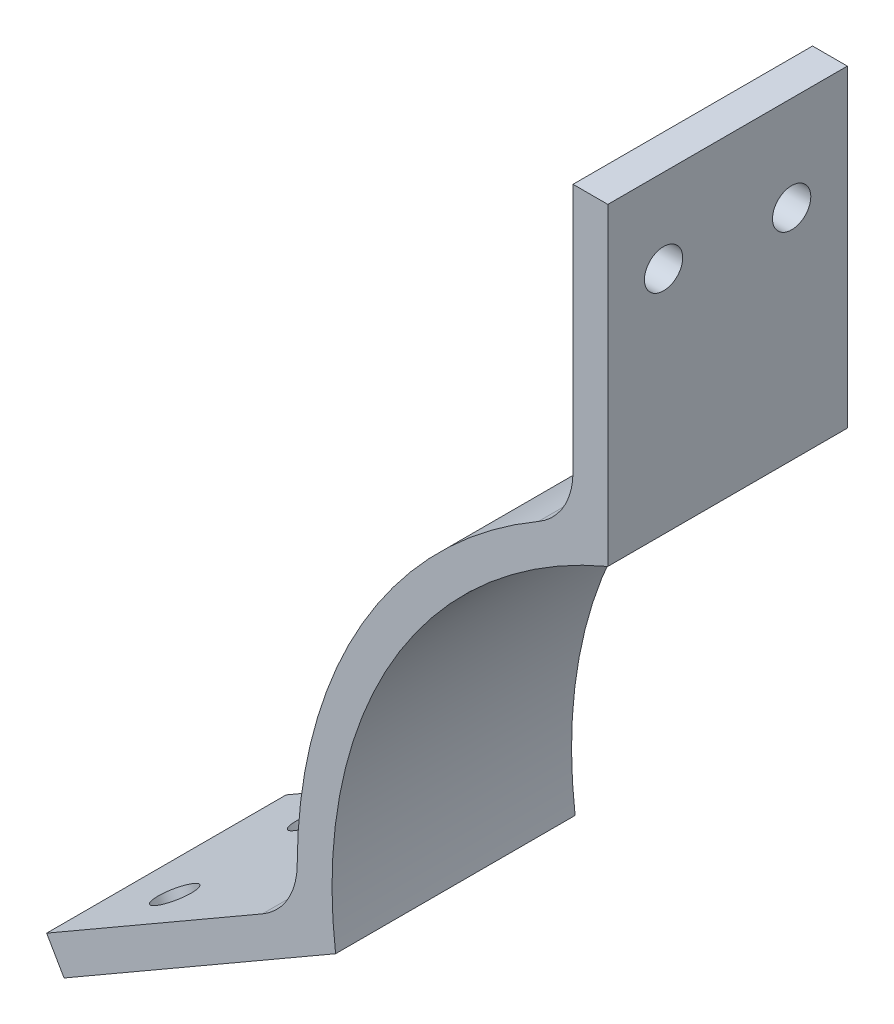
ISO-10303-21;
HEADER;
FILE_DESCRIPTION(('STEP AP214'),'2;1');
FILE_NAME('part.step','',(''),(''),'','','');
FILE_SCHEMA(('AUTOMOTIVE_DESIGN { 1 0 10303 214 1 1 1 1 }'));
ENDSEC;
DATA;
#1=APPLICATION_CONTEXT('core data for automotive mechanical design processes');
#2=APPLICATION_PROTOCOL_DEFINITION('international standard','automotive_design',2000,#1);
#3=PRODUCT_CONTEXT('',#1,'mechanical');
#4=PRODUCT('Part','Part','',(#3));
#5=PRODUCT_RELATED_PRODUCT_CATEGORY('part','',(#4));
#6=PRODUCT_DEFINITION_FORMATION('','',#4);
#7=PRODUCT_DEFINITION_CONTEXT('part definition',#1,'design');
#8=PRODUCT_DEFINITION('design','',#6,#7);
#9=PRODUCT_DEFINITION_SHAPE('','',#8);
#10=(LENGTH_UNIT() NAMED_UNIT(*) SI_UNIT(.MILLI.,.METRE.));
#11=(NAMED_UNIT(*) PLANE_ANGLE_UNIT() SI_UNIT($,.RADIAN.));
#12=(NAMED_UNIT(*) SI_UNIT($,.STERADIAN.) SOLID_ANGLE_UNIT());
#13=UNCERTAINTY_MEASURE_WITH_UNIT(LENGTH_MEASURE(1.E-05),#10,'distance_accuracy_value','');
#14=(GEOMETRIC_REPRESENTATION_CONTEXT(3) GLOBAL_UNCERTAINTY_ASSIGNED_CONTEXT((#13)) GLOBAL_UNIT_ASSIGNED_CONTEXT((#10,
#11,#12)) REPRESENTATION_CONTEXT('',''));
#15=CARTESIAN_POINT('',(0.,0.,0.));
#16=DIRECTION('',(0.,0.,1.));
#17=DIRECTION('',(1.,0.,0.));
#18=AXIS2_PLACEMENT_3D('',#15,#16,#17);
#19=CARTESIAN_POINT('',(0.,0.,34.4));
#20=DIRECTION('',(0.,0.,-1.));
#21=DIRECTION('',(-1.,0.,0.));
#22=AXIS2_PLACEMENT_3D('',#19,#20,#21);
#23=CYLINDRICAL_SURFACE('',#22,64.615);
#24=CARTESIAN_POINT('',(0.,0.,0.));
#25=DIRECTION('',(0.,0.,1.));
#26=DIRECTION('',(1.,0.,0.));
#27=AXIS2_PLACEMENT_3D('',#24,#25,#26);
#28=CIRCLE('',#27,64.615);
#29=CARTESIAN_POINT('',(-25.,59.5827007192524,0.));
#30=VERTEX_POINT('',#29);
#31=CARTESIAN_POINT('',(-64.1001324489579,-8.14071526501525,0.));
#32=VERTEX_POINT('',#31);
#33=EDGE_CURVE('E127',#30,#32,#28,.T.);
#34=ORIENTED_EDGE('',*,*,#33,.F.);
#35=DIRECTION('',(0.,0.,-1.));
#36=VECTOR('',#35,1.);
#37=CARTESIAN_POINT('',(-25.,59.5827007192524,34.4));
#38=LINE('',#37,#36);
#39=CARTESIAN_POINT('',(-25.,59.5827007192524,34.4));
#40=VERTEX_POINT('',#39);
#41=EDGE_CURVE('E121',#40,#30,#38,.T.);
#42=ORIENTED_EDGE('',*,*,#41,.F.);
#43=CARTESIAN_POINT('',(0.,0.,34.4));
#44=DIRECTION('',(0.,0.,1.));
#45=DIRECTION('',(1.,0.,0.));
#46=AXIS2_PLACEMENT_3D('',#43,#44,#45);
#47=CIRCLE('',#46,64.615);
#48=CARTESIAN_POINT('',(-64.1001324489579,-8.14071526501525,34.4));
#49=VERTEX_POINT('',#48);
#50=EDGE_CURVE('E124',#40,#49,#47,.T.);
#51=ORIENTED_EDGE('',*,*,#50,.T.);
#52=DIRECTION('',(0.,0.,-1.));
#53=VECTOR('',#52,1.);
#54=CARTESIAN_POINT('',(-64.1001324489579,-8.14071526501525,34.4));
#55=LINE('',#54,#53);
#56=EDGE_CURVE('E167',#49,#32,#55,.T.);
#57=ORIENTED_EDGE('',*,*,#56,.T.);
#58=EDGE_LOOP('',(#34,#42,#51,#57));
#59=FACE_BOUND('',#58,.T.);
#60=ADVANCED_FACE('F42',(#59),#23,.F.);
#61=CARTESIAN_POINT('',(-25.,0.,34.4));
#62=DIRECTION('',(-1.,0.,0.));
#63=DIRECTION('',(0.,-1.,0.));
#64=AXIS2_PLACEMENT_3D('',#61,#62,#63);
#65=PLANE('',#64);
#66=CARTESIAN_POINT('',(-25.,91.005208591123,8.));
#67=DIRECTION('',(-1.,0.,0.));
#68=DIRECTION('',(0.,-1.,0.));
#69=AXIS2_PLACEMENT_3D('',#66,#67,#68);
#70=CIRCLE('',#69,2.75);
#71=CARTESIAN_POINT('',(-25.,88.255208591123,8.));
#72=VERTEX_POINT('',#71);
#73=EDGE_CURVE('E225',#72,#72,#70,.T.);
#74=ORIENTED_EDGE('',*,*,#73,.T.);
#75=EDGE_LOOP('',(#74));
#76=FACE_BOUND('',#75,.T.);
#77=CARTESIAN_POINT('',(-25.,92.615,26.4));
#78=DIRECTION('',(-1.,0.,0.));
#79=DIRECTION('',(0.,-1.,0.));
#80=AXIS2_PLACEMENT_3D('',#77,#78,#79);
#81=CIRCLE('',#80,2.75);
#82=CARTESIAN_POINT('',(-25.,89.8649999999999,26.4));
#83=VERTEX_POINT('',#82);
#84=EDGE_CURVE('E216',#83,#83,#81,.T.);
#85=ORIENTED_EDGE('',*,*,#84,.T.);
#86=EDGE_LOOP('',(#85));
#87=FACE_BOUND('',#86,.T.);
#88=DIRECTION('',(0.,1.,0.));
#89=VECTOR('',#88,1.);
#90=CARTESIAN_POINT('',(-25.,0.,0.));
#91=LINE('',#90,#89);
#92=CARTESIAN_POINT('',(-25.,104.615,0.));
#93=VERTEX_POINT('',#92);
#94=EDGE_CURVE('E169',#30,#93,#91,.T.);
#95=ORIENTED_EDGE('',*,*,#94,.T.);
#96=DIRECTION('',(0.,0.,-1.));
#97=VECTOR('',#96,1.);
#98=CARTESIAN_POINT('',(-25.,104.615,34.4));
#99=LINE('',#98,#97);
#100=CARTESIAN_POINT('',(-25.,104.615,34.4));
#101=VERTEX_POINT('',#100);
#102=EDGE_CURVE('E131',#101,#93,#99,.T.);
#103=ORIENTED_EDGE('',*,*,#102,.F.);
#104=DIRECTION('',(0.,1.,0.));
#105=VECTOR('',#104,1.);
#106=CARTESIAN_POINT('',(-25.,0.,34.4));
#107=LINE('',#106,#105);
#108=EDGE_CURVE('E134',#40,#101,#107,.T.);
#109=ORIENTED_EDGE('',*,*,#108,.F.);
#110=ORIENTED_EDGE('',*,*,#41,.T.);
#111=EDGE_LOOP('',(#95,#103,#109,#110));
#112=FACE_BOUND('',#111,.T.);
#113=ADVANCED_FACE('F135',(#76,#87,#112),#65,.F.);
#114=CARTESIAN_POINT('',(-8.71094862908707E-13,104.615,34.4));
#115=DIRECTION('',(0.,-1.,0.));
#116=DIRECTION('',(1.,0.,0.));
#117=AXIS2_PLACEMENT_3D('',#114,#115,#116);
#118=PLANE('',#117);
#119=DIRECTION('',(-1.,0.,0.));
#120=VECTOR('',#119,1.);
#121=CARTESIAN_POINT('',(-8.71094862908707E-13,104.615,0.));
#122=LINE('',#121,#120);
#123=CARTESIAN_POINT('',(-30.,104.615,0.));
#124=VERTEX_POINT('',#123);
#125=EDGE_CURVE('E172',#93,#124,#122,.T.);
#126=ORIENTED_EDGE('',*,*,#125,.T.);
#127=DIRECTION('',(0.,0.,-1.));
#128=VECTOR('',#127,1.);
#129=CARTESIAN_POINT('',(-30.,104.615,34.4));
#130=LINE('',#129,#128);
#131=CARTESIAN_POINT('',(-30.,104.615,34.4));
#132=VERTEX_POINT('',#131);
#133=EDGE_CURVE('E189',#132,#124,#130,.T.);
#134=ORIENTED_EDGE('',*,*,#133,.F.);
#135=DIRECTION('',(-1.,0.,0.));
#136=VECTOR('',#135,1.);
#137=CARTESIAN_POINT('',(-8.71094862908707E-13,104.615,34.4));
#138=LINE('',#137,#136);
#139=EDGE_CURVE('E139',#101,#132,#138,.T.);
#140=ORIENTED_EDGE('',*,*,#139,.F.);
#141=ORIENTED_EDGE('',*,*,#102,.T.);
#142=EDGE_LOOP('',(#126,#134,#140,#141));
#143=FACE_BOUND('',#142,.T.);
#144=ADVANCED_FACE('F239',(#143),#118,.F.);
#145=CARTESIAN_POINT('',(-30.,0.,34.4));
#146=DIRECTION('',(1.,0.,0.));
#147=DIRECTION('',(0.,1.,0.));
#148=AXIS2_PLACEMENT_3D('',#145,#146,#147);
#149=PLANE('',#148);
#150=CARTESIAN_POINT('',(-30.,91.005208591123,8.));
#151=DIRECTION('',(-1.,0.,0.));
#152=DIRECTION('',(0.,0.,1.));
#153=AXIS2_PLACEMENT_3D('',#150,#151,#152);
#154=CIRCLE('',#153,2.75);
#155=CARTESIAN_POINT('',(-30.,91.005208591123,10.75));
#156=VERTEX_POINT('',#155);
#157=EDGE_CURVE('E228',#156,#156,#154,.T.);
#158=ORIENTED_EDGE('',*,*,#157,.F.);
#159=EDGE_LOOP('',(#158));
#160=FACE_BOUND('',#159,.T.);
#161=CARTESIAN_POINT('',(-30.,92.615,26.4));
#162=DIRECTION('',(-1.,0.,0.));
#163=DIRECTION('',(0.,0.,1.));
#164=AXIS2_PLACEMENT_3D('',#161,#162,#163);
#165=CIRCLE('',#164,2.75);
#166=CARTESIAN_POINT('',(-30.,92.615,29.15));
#167=VERTEX_POINT('',#166);
#168=EDGE_CURVE('E220',#167,#167,#165,.T.);
#169=ORIENTED_EDGE('',*,*,#168,.F.);
#170=EDGE_LOOP('',(#169));
#171=FACE_BOUND('',#170,.T.);
#172=DIRECTION('',(0.,-1.,0.));
#173=VECTOR('',#172,1.);
#174=CARTESIAN_POINT('',(-30.,0.,0.));
#175=LINE('',#174,#173);
#176=CARTESIAN_POINT('',(-30.,68.8371137178194,0.));
#177=VERTEX_POINT('',#176);
#178=EDGE_CURVE('E174',#124,#177,#175,.T.);
#179=ORIENTED_EDGE('',*,*,#178,.T.);
#180=DIRECTION('',(0.,0.,1.));
#181=VECTOR('',#180,1.);
#182=CARTESIAN_POINT('',(-30.,68.8371137178194,34.4));
#183=LINE('',#182,#181);
#184=CARTESIAN_POINT('',(-30.,68.8371137178194,34.4));
#185=VERTEX_POINT('',#184);
#186=EDGE_CURVE('E59',#177,#185,#183,.T.);
#187=ORIENTED_EDGE('',*,*,#186,.T.);
#188=DIRECTION('',(0.,-1.,0.));
#189=VECTOR('',#188,1.);
#190=CARTESIAN_POINT('',(-30.,0.,34.4));
#191=LINE('',#190,#189);
#192=EDGE_CURVE('E155',#132,#185,#191,.T.);
#193=ORIENTED_EDGE('',*,*,#192,.F.);
#194=ORIENTED_EDGE('',*,*,#133,.T.);
#195=EDGE_LOOP('',(#179,#187,#193,#194));
#196=FACE_BOUND('',#195,.T.);
#197=ADVANCED_FACE('F235',(#160,#171,#196),#149,.F.);
#198=CARTESIAN_POINT('',(0.,0.,34.4));
#199=DIRECTION('',(0.,0.,-1.));
#200=DIRECTION('',(-1.,0.,0.));
#201=AXIS2_PLACEMENT_3D('',#198,#199,#200);
#202=CYLINDRICAL_SURFACE('',#201,69.615);
#203=CARTESIAN_POINT('',(0.,0.,0.));
#204=DIRECTION('',(0.,0.,1.));
#205=DIRECTION('',(1.,0.,0.));
#206=AXIS2_PLACEMENT_3D('',#203,#204,#205);
#207=CIRCLE('',#206,69.615);
#208=CARTESIAN_POINT('',(-34.9758211392325,60.1908644283866,0.));
#209=VERTEX_POINT('',#208);
#210=CARTESIAN_POINT('',(-69.6147282403442,0.194517410602863,0.));
#211=VERTEX_POINT('',#210);
#212=EDGE_CURVE('E176',#209,#211,#207,.T.);
#213=ORIENTED_EDGE('',*,*,#212,.T.);
#214=DIRECTION('',(0.,0.,-1.));
#215=VECTOR('',#214,1.);
#216=CARTESIAN_POINT('',(-69.6147282403442,0.194517410602863,34.4));
#217=LINE('',#216,#215);
#218=CARTESIAN_POINT('',(-69.6147282403442,0.194517410602863,34.4));
#219=VERTEX_POINT('',#218);
#220=EDGE_CURVE('E198',#211,#219,#217,.F.);
#221=ORIENTED_EDGE('',*,*,#220,.T.);
#222=CARTESIAN_POINT('',(0.,0.,34.4));
#223=DIRECTION('',(0.,0.,1.));
#224=DIRECTION('',(1.,0.,0.));
#225=AXIS2_PLACEMENT_3D('',#222,#223,#224);
#226=CIRCLE('',#225,69.615);
#227=CARTESIAN_POINT('',(-34.9758211392325,60.1908644283866,34.4));
#228=VERTEX_POINT('',#227);
#229=EDGE_CURVE('E157',#228,#219,#226,.T.);
#230=ORIENTED_EDGE('',*,*,#229,.F.);
#231=DIRECTION('',(0.,0.,-1.));
#232=VECTOR('',#231,1.);
#233=CARTESIAN_POINT('',(-34.9758211392325,60.1908644283866,34.4));
#234=LINE('',#233,#232);
#235=EDGE_CURVE('E195',#228,#209,#234,.T.);
#236=ORIENTED_EDGE('',*,*,#235,.T.);
#237=EDGE_LOOP('',(#213,#221,#230,#236));
#238=FACE_BOUND('',#237,.T.);
#239=ADVANCED_FACE('F238',(#238),#202,.T.);
#240=CARTESIAN_POINT('',(-15.,25.9807621135331,34.4));
#241=DIRECTION('',(-0.5,0.866025403784438,0.));
#242=DIRECTION('',(-0.866025403784439,-0.5,0.));
#243=AXIS2_PLACEMENT_3D('',#240,#241,#242);
#244=PLANE('',#243);
#245=CARTESIAN_POINT('',(-95.2069427714958,-20.3267378864669,26.4));
#246=DIRECTION('',(-0.5,0.866025403784438,0.));
#247=DIRECTION('',(-0.866025403784439,-0.5,0.));
#248=AXIS2_PLACEMENT_3D('',#245,#246,#247);
#249=CIRCLE('',#248,2.75);
#250=CARTESIAN_POINT('',(-97.588512631903,-21.7017378864669,26.4));
#251=VERTEX_POINT('',#250);
#252=EDGE_CURVE('E212',#251,#251,#249,.T.);
#253=ORIENTED_EDGE('',*,*,#252,.F.);
#254=EDGE_LOOP('',(#253));
#255=FACE_BOUND('',#254,.T.);
#256=CARTESIAN_POINT('',(-93.8128225166144,-19.5218421820284,8.));
#257=DIRECTION('',(-0.5,0.866025403784438,0.));
#258=DIRECTION('',(-0.866025403784439,-0.5,0.));
#259=AXIS2_PLACEMENT_3D('',#256,#257,#258);
#260=CIRCLE('',#259,2.75);
#261=CARTESIAN_POINT('',(-96.1943923770216,-20.8968421820284,8.));
#262=VERTEX_POINT('',#261);
#263=EDGE_CURVE('E151',#262,#262,#260,.T.);
#264=ORIENTED_EDGE('',*,*,#263,.F.);
#265=EDGE_LOOP('',(#264));
#266=FACE_BOUND('',#265,.T.);
#267=DIRECTION('',(0.866025403784438,0.5,0.));
#268=VECTOR('',#267,1.);
#269=CARTESIAN_POINT('',(-15.,25.9807621135331,34.4));
#270=LINE('',#269,#268);
#271=CARTESIAN_POINT('',(-105.599247616909,-26.3267378864669,34.4));
#272=VERTEX_POINT('',#271);
#273=CARTESIAN_POINT('',(-74.6146892028299,-8.43779474537657,34.4));
#274=VERTEX_POINT('',#273);
#275=EDGE_CURVE('E160',#272,#274,#270,.T.);
#276=ORIENTED_EDGE('',*,*,#275,.T.);
#277=DIRECTION('',(0.,0.,-1.));
#278=VECTOR('',#277,1.);
#279=CARTESIAN_POINT('',(-74.6146892028299,-8.43779474537657,34.4));
#280=LINE('',#279,#278);
#281=CARTESIAN_POINT('',(-74.6146892028299,-8.43779474537657,0.));
#282=VERTEX_POINT('',#281);
#283=EDGE_CURVE('E130',#274,#282,#280,.T.);
#284=ORIENTED_EDGE('',*,*,#283,.T.);
#285=DIRECTION('',(0.866025403784438,0.5,0.));
#286=VECTOR('',#285,1.);
#287=CARTESIAN_POINT('',(-15.,25.9807621135331,0.));
#288=LINE('',#287,#286);
#289=CARTESIAN_POINT('',(-105.599247616909,-26.3267378864669,0.));
#290=VERTEX_POINT('',#289);
#291=EDGE_CURVE('E179',#290,#282,#288,.T.);
#292=ORIENTED_EDGE('',*,*,#291,.F.);
#293=DIRECTION('',(0.,0.,-1.));
#294=VECTOR('',#293,1.);
#295=CARTESIAN_POINT('',(-105.599247616909,-26.3267378864669,34.4));
#296=LINE('',#295,#294);
#297=EDGE_CURVE('E187',#272,#290,#296,.T.);
#298=ORIENTED_EDGE('',*,*,#297,.F.);
#299=EDGE_LOOP('',(#276,#284,#292,#298));
#300=FACE_BOUND('',#299,.T.);
#301=ADVANCED_FACE('F256',(#255,#266,#300),#244,.T.);
#302=CARTESIAN_POINT('',(-90.5992476169093,-52.3074999999998,34.4));
#303=DIRECTION('',(-0.86602540378444,-0.499999999999997,0.));
#304=DIRECTION('',(0.499999999999997,-0.86602540378444,0.));
#305=AXIS2_PLACEMENT_3D('',#302,#303,#304);
#306=PLANE('',#305);
#307=DIRECTION('',(-0.499999999999997,0.86602540378444,0.));
#308=VECTOR('',#307,1.);
#309=CARTESIAN_POINT('',(-90.5992476169093,-52.3074999999998,0.));
#310=LINE('',#309,#308);
#311=CARTESIAN_POINT('',(-103.099247616909,-30.6568649053891,0.));
#312=VERTEX_POINT('',#311);
#313=EDGE_CURVE('E148',#312,#290,#310,.T.);
#314=ORIENTED_EDGE('',*,*,#313,.F.);
#315=DIRECTION('',(0.,0.,-1.));
#316=VECTOR('',#315,1.);
#317=CARTESIAN_POINT('',(-103.099247616909,-30.6568649053891,34.4));
#318=LINE('',#317,#316);
#319=CARTESIAN_POINT('',(-103.099247616909,-30.6568649053891,34.4));
#320=VERTEX_POINT('',#319);
#321=EDGE_CURVE('E185',#320,#312,#318,.T.);
#322=ORIENTED_EDGE('',*,*,#321,.F.);
#323=DIRECTION('',(-0.499999999999997,0.86602540378444,0.));
#324=VECTOR('',#323,1.);
#325=CARTESIAN_POINT('',(-90.5992476169093,-52.3074999999998,34.4));
#326=LINE('',#325,#324);
#327=EDGE_CURVE('E163',#320,#272,#326,.T.);
#328=ORIENTED_EDGE('',*,*,#327,.T.);
#329=ORIENTED_EDGE('',*,*,#297,.T.);
#330=EDGE_LOOP('',(#314,#322,#328,#329));
#331=FACE_BOUND('',#330,.T.);
#332=ADVANCED_FACE('F260',(#331),#306,.T.);
#333=CARTESIAN_POINT('',(-12.5,21.650635094611,34.4));
#334=DIRECTION('',(0.500000000000001,-0.866025403784438,0.));
#335=DIRECTION('',(0.866025403784438,0.500000000000001,0.));
#336=AXIS2_PLACEMENT_3D('',#333,#334,#335);
#337=PLANE('',#336);
#338=CARTESIAN_POINT('',(-92.7069427714957,-24.6568649053891,26.4));
#339=DIRECTION('',(0.500000000000001,-0.866025403784438,0.));
#340=DIRECTION('',(0.866025403784438,0.500000000000001,0.));
#341=AXIS2_PLACEMENT_3D('',#338,#339,#340);
#342=CIRCLE('',#341,2.75);
#343=CARTESIAN_POINT('',(-95.0885126319029,-26.0318649053891,26.4));
#344=VERTEX_POINT('',#343);
#345=EDGE_CURVE('E46',#344,#344,#342,.T.);
#346=ORIENTED_EDGE('',*,*,#345,.F.);
#347=EDGE_LOOP('',(#346));
#348=FACE_BOUND('',#347,.T.);
#349=CARTESIAN_POINT('',(-91.3128225166144,-23.8519692009506,8.));
#350=DIRECTION('',(0.500000000000001,-0.866025403784438,0.));
#351=DIRECTION('',(0.866025403784438,0.500000000000001,0.));
#352=AXIS2_PLACEMENT_3D('',#349,#350,#351);
#353=CIRCLE('',#352,2.75);
#354=CARTESIAN_POINT('',(-93.6943923770216,-25.2269692009506,8.));
#355=VERTEX_POINT('',#354);
#356=EDGE_CURVE('E170',#355,#355,#353,.T.);
#357=ORIENTED_EDGE('',*,*,#356,.F.);
#358=EDGE_LOOP('',(#357));
#359=FACE_BOUND('',#358,.T.);
#360=DIRECTION('',(-0.866025403784438,-0.500000000000001,0.));
#361=VECTOR('',#360,1.);
#362=CARTESIAN_POINT('',(-12.5,21.650635094611,0.));
#363=LINE('',#362,#361);
#364=EDGE_CURVE('E145',#32,#312,#363,.T.);
#365=ORIENTED_EDGE('',*,*,#364,.F.);
#366=ORIENTED_EDGE('',*,*,#56,.F.);
#367=DIRECTION('',(-0.866025403784438,-0.500000000000001,0.));
#368=VECTOR('',#367,1.);
#369=CARTESIAN_POINT('',(-12.5,21.650635094611,34.4));
#370=LINE('',#369,#368);
#371=EDGE_CURVE('E144',#49,#320,#370,.T.);
#372=ORIENTED_EDGE('',*,*,#371,.T.);
#373=ORIENTED_EDGE('',*,*,#321,.T.);
#374=EDGE_LOOP('',(#365,#366,#372,#373));
#375=FACE_BOUND('',#374,.T.);
#376=ADVANCED_FACE('F263',(#348,#359,#375),#337,.T.);
#377=CARTESIAN_POINT('',(0.,0.,34.4));
#378=DIRECTION('',(0.,0.,1.));
#379=DIRECTION('',(1.,0.,0.));
#380=AXIS2_PLACEMENT_3D('',#377,#378,#379);
#381=PLANE('',#380);
#382=ORIENTED_EDGE('',*,*,#50,.F.);
#383=ORIENTED_EDGE('',*,*,#108,.T.);
#384=ORIENTED_EDGE('',*,*,#139,.T.);
#385=ORIENTED_EDGE('',*,*,#192,.T.);
#386=CARTESIAN_POINT('',(-40.,68.8371137178194,34.4));
#387=DIRECTION('',(0.,0.,1.));
#388=DIRECTION('',(1.,0.,0.));
#389=AXIS2_PLACEMENT_3D('',#386,#387,#388);
#390=CIRCLE('',#389,10.);
#391=EDGE_CURVE('E11',#185,#228,#390,.F.);
#392=ORIENTED_EDGE('',*,*,#391,.T.);
#393=ORIENTED_EDGE('',*,*,#229,.T.);
#394=CARTESIAN_POINT('',(-79.6146892028299,0.222459292467815,34.4));
#395=DIRECTION('',(0.,0.,1.));
#396=DIRECTION('',(1.,0.,0.));
#397=AXIS2_PLACEMENT_3D('',#394,#395,#396);
#398=CIRCLE('',#397,10.);
#399=EDGE_CURVE('E203',#219,#274,#398,.F.);
#400=ORIENTED_EDGE('',*,*,#399,.T.);
#401=ORIENTED_EDGE('',*,*,#275,.F.);
#402=ORIENTED_EDGE('',*,*,#327,.F.);
#403=ORIENTED_EDGE('',*,*,#371,.F.);
#404=EDGE_LOOP('',(#382,#383,#384,#385,#392,#393,#400,#401,#402,#403));
#405=FACE_BOUND('',#404,.T.);
#406=ADVANCED_FACE('F141',(#405),#381,.T.);
#407=CARTESIAN_POINT('',(0.,0.,0.));
#408=DIRECTION('',(0.,0.,1.));
#409=DIRECTION('',(1.,0.,0.));
#410=AXIS2_PLACEMENT_3D('',#407,#408,#409);
#411=PLANE('',#410);
#412=ORIENTED_EDGE('',*,*,#33,.T.);
#413=ORIENTED_EDGE('',*,*,#364,.T.);
#414=ORIENTED_EDGE('',*,*,#313,.T.);
#415=ORIENTED_EDGE('',*,*,#291,.T.);
#416=CARTESIAN_POINT('',(-79.6146892028299,0.222459292467815,0.));
#417=DIRECTION('',(0.,0.,1.));
#418=DIRECTION('',(1.,0.,0.));
#419=AXIS2_PLACEMENT_3D('',#416,#417,#418);
#420=CIRCLE('',#419,10.);
#421=EDGE_CURVE('E201',#282,#211,#420,.T.);
#422=ORIENTED_EDGE('',*,*,#421,.T.);
#423=ORIENTED_EDGE('',*,*,#212,.F.);
#424=CARTESIAN_POINT('',(-40.,68.8371137178194,0.));
#425=DIRECTION('',(0.,0.,1.));
#426=DIRECTION('',(1.,0.,0.));
#427=AXIS2_PLACEMENT_3D('',#424,#425,#426);
#428=CIRCLE('',#427,10.);
#429=EDGE_CURVE('E51',#209,#177,#428,.T.);
#430=ORIENTED_EDGE('',*,*,#429,.T.);
#431=ORIENTED_EDGE('',*,*,#178,.F.);
#432=ORIENTED_EDGE('',*,*,#125,.F.);
#433=ORIENTED_EDGE('',*,*,#94,.F.);
#434=EDGE_LOOP('',(#412,#413,#414,#415,#422,#423,#430,#431,#432,#433));
#435=FACE_BOUND('',#434,.T.);
#436=ADVANCED_FACE('F264',(#435),#411,.F.);
#437=CARTESIAN_POINT('',(-79.6146892028299,0.222459292467815,34.4));
#438=DIRECTION('',(0.,0.,-1.));
#439=DIRECTION('',(-1.,0.,0.));
#440=AXIS2_PLACEMENT_3D('',#437,#438,#439);
#441=CYLINDRICAL_SURFACE('',#440,10.);
#442=ORIENTED_EDGE('',*,*,#399,.F.);
#443=ORIENTED_EDGE('',*,*,#220,.F.);
#444=ORIENTED_EDGE('',*,*,#421,.F.);
#445=ORIENTED_EDGE('',*,*,#283,.F.);
#446=EDGE_LOOP('',(#442,#443,#444,#445));
#447=FACE_BOUND('',#446,.T.);
#448=ADVANCED_FACE('F252',(#447),#441,.F.);
#449=CARTESIAN_POINT('',(-40.,68.8371137178194,34.4));
#450=DIRECTION('',(0.,0.,-1.));
#451=DIRECTION('',(-1.,0.,0.));
#452=AXIS2_PLACEMENT_3D('',#449,#450,#451);
#453=CYLINDRICAL_SURFACE('',#452,10.);
#454=ORIENTED_EDGE('',*,*,#391,.F.);
#455=ORIENTED_EDGE('',*,*,#186,.F.);
#456=ORIENTED_EDGE('',*,*,#429,.F.);
#457=ORIENTED_EDGE('',*,*,#235,.F.);
#458=EDGE_LOOP('',(#454,#455,#456,#457));
#459=FACE_BOUND('',#458,.T.);
#460=ADVANCED_FACE('F44',(#459),#453,.F.);
#461=CARTESIAN_POINT('',(-93.8128225166144,-19.5218421820284,8.));
#462=DIRECTION('',(-0.5,0.866025403784438,0.));
#463=DIRECTION('',(-0.866025403784439,-0.5,0.));
#464=AXIS2_PLACEMENT_3D('',#461,#462,#463);
#465=CYLINDRICAL_SURFACE('',#464,2.75);
#466=CARTESIAN_POINT('',(-93.6943923770216,-25.2269692009506,8.));
#467=CARTESIAN_POINT('',(-93.7204340436882,-25.1818637111702,8.));
#468=CARTESIAN_POINT('',(-93.7464757103549,-25.1367582213897,8.));
#469=CARTESIAN_POINT('',(-93.7985590436883,-25.0465472418288,8.));
#470=CARTESIAN_POINT('',(-93.8246007103549,-25.0014417520484,8.));
#471=CARTESIAN_POINT('',(-93.8766840436883,-24.9112307724875,8.));
#472=CARTESIAN_POINT('',(-93.9027257103549,-24.8661252827071,8.));
#473=CARTESIAN_POINT('',(-93.9548090436883,-24.7759143031462,8.));
#474=CARTESIAN_POINT('',(-93.9808507103549,-24.7308088133658,8.));
#475=CARTESIAN_POINT('',(-94.0329340436883,-24.6405978338049,8.));
#476=CARTESIAN_POINT('',(-94.0589757103549,-24.5954923440244,8.));
#477=CARTESIAN_POINT('',(-94.1110590436883,-24.5052813644636,8.));
#478=CARTESIAN_POINT('',(-94.1371007103549,-24.4601758746831,8.));
#479=CARTESIAN_POINT('',(-94.1891840436883,-24.3699648951223,8.));
#480=CARTESIAN_POINT('',(-94.2152257103549,-24.3248594053418,8.));
#481=CARTESIAN_POINT('',(-94.2673090436883,-24.2346484257809,8.));
#482=CARTESIAN_POINT('',(-94.2933507103549,-24.1895429360005,8.));
#483=CARTESIAN_POINT('',(-94.3454340436883,-24.0993319564396,8.));
#484=CARTESIAN_POINT('',(-94.3714757103549,-24.0542264666592,8.));
#485=CARTESIAN_POINT('',(-94.4235590436883,-23.9640154870983,8.));
#486=CARTESIAN_POINT('',(-94.4496007103549,-23.9189099973179,8.));
#487=CARTESIAN_POINT('',(-94.5016840436883,-23.828699017757,8.));
#488=CARTESIAN_POINT('',(-94.5277257103549,-23.7835935279765,8.));
#489=CARTESIAN_POINT('',(-94.5798090436883,-23.6933825484157,8.));
#490=CARTESIAN_POINT('',(-94.6058507103549,-23.6482770586352,8.));
#491=CARTESIAN_POINT('',(-94.6579340436883,-23.5580660790743,8.));
#492=CARTESIAN_POINT('',(-94.6839757103549,-23.5129605892939,8.));
#493=CARTESIAN_POINT('',(-94.7360590436883,-23.422749609733,8.));
#494=CARTESIAN_POINT('',(-94.7621007103549,-23.3776441199526,8.));
#495=CARTESIAN_POINT('',(-94.8141840436883,-23.2874331403917,8.));
#496=CARTESIAN_POINT('',(-94.8402257103549,-23.2423276506113,8.));
#497=CARTESIAN_POINT('',(-94.8923090436883,-23.1521166710504,8.));
#498=CARTESIAN_POINT('',(-94.9183507103549,-23.1070111812699,8.));
#499=CARTESIAN_POINT('',(-94.9704340436883,-23.0168002017091,8.));
#500=CARTESIAN_POINT('',(-94.9964757103549,-22.9716947119286,8.));
#501=CARTESIAN_POINT('',(-95.0485590436883,-22.8814837323677,8.));
#502=CARTESIAN_POINT('',(-95.0746007103549,-22.8363782425873,8.));
#503=CARTESIAN_POINT('',(-95.1266840436883,-22.7461672630264,8.));
#504=CARTESIAN_POINT('',(-95.1527257103549,-22.701061773246,8.));
#505=CARTESIAN_POINT('',(-95.2048090436883,-22.6108507936851,8.));
#506=CARTESIAN_POINT('',(-95.2308507103549,-22.5657453039047,8.));
#507=CARTESIAN_POINT('',(-95.2829340436883,-22.4755343243438,8.));
#508=CARTESIAN_POINT('',(-95.3089757103549,-22.4304288345633,8.));
#509=CARTESIAN_POINT('',(-95.3610590436883,-22.3402178550025,8.));
#510=CARTESIAN_POINT('',(-95.3871007103549,-22.295112365222,8.));
#511=CARTESIAN_POINT('',(-95.4391840436883,-22.2049013856611,8.));
#512=CARTESIAN_POINT('',(-95.4652257103549,-22.1597958958807,8.));
#513=CARTESIAN_POINT('',(-95.5173090436883,-22.0695849163198,8.));
#514=CARTESIAN_POINT('',(-95.5433507103549,-22.0244794265394,8.));
#515=CARTESIAN_POINT('',(-95.5954340436883,-21.9342684469785,8.));
#516=CARTESIAN_POINT('',(-95.6214757103549,-21.8891629571981,8.));
#517=CARTESIAN_POINT('',(-95.6735590436883,-21.7989519776372,8.));
#518=CARTESIAN_POINT('',(-95.6996007103549,-21.7538464878567,8.));
#519=CARTESIAN_POINT('',(-95.7516840436883,-21.6636355082959,8.));
#520=CARTESIAN_POINT('',(-95.7777257103549,-21.6185300185154,8.));
#521=CARTESIAN_POINT('',(-95.8298090436883,-21.5283190389546,8.));
#522=CARTESIAN_POINT('',(-95.8558507103549,-21.4832135491741,8.));
#523=CARTESIAN_POINT('',(-95.9079340436883,-21.3930025696132,8.));
#524=CARTESIAN_POINT('',(-95.9339757103549,-21.3478970798328,8.));
#525=CARTESIAN_POINT('',(-95.9860590436883,-21.2576861002719,8.));
#526=CARTESIAN_POINT('',(-96.0121007103549,-21.2125806104915,8.));
#527=CARTESIAN_POINT('',(-96.0641840436883,-21.1223696309306,8.));
#528=CARTESIAN_POINT('',(-96.0902257103549,-21.0772641411502,8.));
#529=CARTESIAN_POINT('',(-96.1423090436883,-20.9870531615893,8.));
#530=CARTESIAN_POINT('',(-96.1683507103549,-20.9419476718088,8.));
#531=CARTESIAN_POINT('',(-96.1943923770216,-20.8968421820284,8.));
#532=B_SPLINE_CURVE_WITH_KNOTS('',3,(#466,#467,#468,#469,#470,#471,#472,#473,#474,#475,#476,
#477,#478,#479,#480,#481,#482,#483,#484,#485,#486,#487,#488,#489,#490,#491,#492,#493,#494,#495,
#496,#497,#498,#499,#500,#501,#502,#503,#504,#505,#506,#507,#508,#509,#510,#511,#512,#513,#514,
#515,#516,#517,#518,#519,#520,#521,#522,#523,#524,#525,#526,#527,#528,#529,#530,#531),
.UNSPECIFIED.,.F.,.F.,(4,2,2,2,2,2,2,2,2,2,2,2,2,2,2,2,2,2,2,2,2,2,2,2,2,2,2,2,2,2,2,2,4),(0.,
0.156250000000003,0.312500000000009,0.468750000000006,0.625000000000006,0.781250000000006,
0.937500000000005,1.09375000000001,1.25,1.40625000000001,1.56250000000001,1.71875000000001,
1.87500000000001,2.03125000000001,2.18750000000001,2.34375000000001,2.50000000000002,
2.65625000000002,2.81250000000002,2.96875000000002,3.12500000000002,3.28125000000001,
3.43750000000002,3.59375000000002,3.75000000000002,3.90625000000002,4.06250000000002,
4.21875000000002,4.37500000000002,4.53125000000003,4.68750000000003,4.84375000000003,
5.00000000000003),.UNSPECIFIED.);
#533=EDGE_CURVE('BSEAM282',#355,#262,#532,.T.);
#534=ORIENTED_EDGE('',*,*,#356,.T.);
#535=ORIENTED_EDGE('',*,*,#263,.T.);
#536=ORIENTED_EDGE('',*,*,#533,.T.);
#537=ORIENTED_EDGE('',*,*,#533,.F.);
#538=EDGE_LOOP('',(#534,#536,#535,#537));
#539=FACE_BOUND('',#538,.T.);
#540=ADVANCED_FACE('F282',(#539),#465,.F.);
#541=CARTESIAN_POINT('',(-95.2069427714958,-20.3267378864669,26.4));
#542=DIRECTION('',(-0.5,0.866025403784438,0.));
#543=DIRECTION('',(-0.866025403784439,-0.5,0.));
#544=AXIS2_PLACEMENT_3D('',#541,#542,#543);
#545=CYLINDRICAL_SURFACE('',#544,2.75);
#546=CARTESIAN_POINT('',(-95.0885126319029,-26.0318649053891,26.4));
#547=CARTESIAN_POINT('',(-95.1145542985696,-25.9867594156086,26.4));
#548=CARTESIAN_POINT('',(-95.1405959652363,-25.9416539258282,26.4));
#549=CARTESIAN_POINT('',(-95.1926792985696,-25.8514429462673,26.4));
#550=CARTESIAN_POINT('',(-95.2187209652363,-25.8063374564869,26.4));
#551=CARTESIAN_POINT('',(-95.2708042985696,-25.716126476926,26.4));
#552=CARTESIAN_POINT('',(-95.2968459652363,-25.6710209871456,26.4));
#553=CARTESIAN_POINT('',(-95.3489292985696,-25.5808100075847,26.4));
#554=CARTESIAN_POINT('',(-95.3749709652363,-25.5357045178042,26.4));
#555=CARTESIAN_POINT('',(-95.4270542985696,-25.4454935382434,26.4));
#556=CARTESIAN_POINT('',(-95.4530959652363,-25.4003880484629,26.4));
#557=CARTESIAN_POINT('',(-95.5051792985696,-25.310177068902,26.4));
#558=CARTESIAN_POINT('',(-95.5312209652363,-25.2650715791216,26.4));
#559=CARTESIAN_POINT('',(-95.5833042985696,-25.1748605995607,26.4));
#560=CARTESIAN_POINT('',(-95.6093459652363,-25.1297551097803,26.4));
#561=CARTESIAN_POINT('',(-95.6614292985696,-25.0395441302194,26.4));
#562=CARTESIAN_POINT('',(-95.6874709652363,-24.994438640439,26.4));
#563=CARTESIAN_POINT('',(-95.7395542985696,-24.9042276608781,26.4));
#564=CARTESIAN_POINT('',(-95.7655959652363,-24.8591221710976,26.4));
#565=CARTESIAN_POINT('',(-95.8176792985696,-24.7689111915368,26.4));
#566=CARTESIAN_POINT('',(-95.8437209652363,-24.7238057017563,26.4));
#567=CARTESIAN_POINT('',(-95.8958042985696,-24.6335947221954,26.4));
#568=CARTESIAN_POINT('',(-95.9218459652363,-24.588489232415,26.4));
#569=CARTESIAN_POINT('',(-95.9739292985696,-24.4982782528541,26.4));
#570=CARTESIAN_POINT('',(-95.9999709652363,-24.4531727630737,26.4));
#571=CARTESIAN_POINT('',(-96.0520542985696,-24.3629617835128,26.4));
#572=CARTESIAN_POINT('',(-96.0780959652363,-24.3178562937324,26.4));
#573=CARTESIAN_POINT('',(-96.1301792985696,-24.2276453141715,26.4));
#574=CARTESIAN_POINT('',(-96.1562209652363,-24.182539824391,26.4));
#575=CARTESIAN_POINT('',(-96.2083042985696,-24.0923288448302,26.4));
#576=CARTESIAN_POINT('',(-96.2343459652363,-24.0472233550497,26.4));
#577=CARTESIAN_POINT('',(-96.2864292985696,-23.9570123754888,26.4));
#578=CARTESIAN_POINT('',(-96.3124709652363,-23.9119068857084,26.4));
#579=CARTESIAN_POINT('',(-96.3645542985696,-23.8216959061475,26.4));
#580=CARTESIAN_POINT('',(-96.3905959652363,-23.7765904163671,26.4));
#581=CARTESIAN_POINT('',(-96.4426792985696,-23.6863794368062,26.4));
#582=CARTESIAN_POINT('',(-96.4687209652363,-23.6412739470258,26.4));
#583=CARTESIAN_POINT('',(-96.5208042985696,-23.5510629674649,26.4));
#584=CARTESIAN_POINT('',(-96.5468459652363,-23.5059574776844,26.4));
#585=CARTESIAN_POINT('',(-96.5989292985696,-23.4157464981236,26.4));
#586=CARTESIAN_POINT('',(-96.6249709652363,-23.3706410083431,26.4));
#587=CARTESIAN_POINT('',(-96.6770542985696,-23.2804300287822,26.4));
#588=CARTESIAN_POINT('',(-96.7030959652363,-23.2353245390018,26.4));
#589=CARTESIAN_POINT('',(-96.7551792985696,-23.1451135594409,26.4));
#590=CARTESIAN_POINT('',(-96.7812209652363,-23.1000080696605,26.4));
#591=CARTESIAN_POINT('',(-96.8333042985696,-23.0097970900996,26.4));
#592=CARTESIAN_POINT('',(-96.8593459652363,-22.9646916003192,26.4));
#593=CARTESIAN_POINT('',(-96.9114292985696,-22.8744806207583,26.4));
#594=CARTESIAN_POINT('',(-96.9374709652363,-22.8293751309778,26.4));
#595=CARTESIAN_POINT('',(-96.9895542985696,-22.739164151417,26.4));
#596=CARTESIAN_POINT('',(-97.0155959652363,-22.6940586616365,26.4));
#597=CARTESIAN_POINT('',(-97.0676792985696,-22.6038476820757,26.4));
#598=CARTESIAN_POINT('',(-97.0937209652363,-22.5587421922952,26.4));
#599=CARTESIAN_POINT('',(-97.1458042985696,-22.4685312127343,26.4));
#600=CARTESIAN_POINT('',(-97.1718459652363,-22.4234257229539,26.4));
#601=CARTESIAN_POINT('',(-97.2239292985696,-22.333214743393,26.4));
#602=CARTESIAN_POINT('',(-97.2499709652363,-22.2881092536126,26.4));
#603=CARTESIAN_POINT('',(-97.3020542985696,-22.1978982740517,26.4));
#604=CARTESIAN_POINT('',(-97.3280959652363,-22.1527927842713,26.4));
#605=CARTESIAN_POINT('',(-97.3801792985696,-22.0625818047104,26.4));
#606=CARTESIAN_POINT('',(-97.4062209652363,-22.0174763149299,26.4));
#607=CARTESIAN_POINT('',(-97.4583042985696,-21.9272653353691,26.4));
#608=CARTESIAN_POINT('',(-97.4843459652363,-21.8821598455886,26.4));
#609=CARTESIAN_POINT('',(-97.5364292985696,-21.7919488660277,26.4));
#610=CARTESIAN_POINT('',(-97.5624709652363,-21.7468433762473,26.4));
#611=CARTESIAN_POINT('',(-97.588512631903,-21.7017378864669,26.4));
#612=B_SPLINE_CURVE_WITH_KNOTS('',3,(#546,#547,#548,#549,#550,#551,#552,#553,#554,#555,#556,
#557,#558,#559,#560,#561,#562,#563,#564,#565,#566,#567,#568,#569,#570,#571,#572,#573,#574,#575,
#576,#577,#578,#579,#580,#581,#582,#583,#584,#585,#586,#587,#588,#589,#590,#591,#592,#593,#594,
#595,#596,#597,#598,#599,#600,#601,#602,#603,#604,#605,#606,#607,#608,#609,#610,#611),
.UNSPECIFIED.,.F.,.F.,(4,2,2,2,2,2,2,2,2,2,2,2,2,2,2,2,2,2,2,2,2,2,2,2,2,2,2,2,2,2,2,2,4),(0.,
0.15625,0.312499999999999,0.468750000000006,0.625000000000006,0.781250000000006,
0.937500000000002,1.09375000000001,1.25,1.40625,1.56250000000001,1.71875000000001,
1.87500000000001,2.03125000000001,2.18750000000001,2.34375000000001,2.50000000000002,
2.65625000000002,2.81250000000002,2.96875000000002,3.12500000000002,3.28125000000002,
3.43750000000001,3.59375000000002,3.75000000000002,3.90625000000002,4.06250000000002,
4.21875000000002,4.37500000000002,4.53125000000002,4.68750000000002,4.84375000000003,
5.00000000000003),.UNSPECIFIED.);
#613=EDGE_CURVE('BSEAM388',#344,#251,#612,.T.);
#614=ORIENTED_EDGE('',*,*,#345,.T.);
#615=ORIENTED_EDGE('',*,*,#252,.T.);
#616=ORIENTED_EDGE('',*,*,#613,.T.);
#617=ORIENTED_EDGE('',*,*,#613,.F.);
#618=EDGE_LOOP('',(#614,#616,#615,#617));
#619=FACE_BOUND('',#618,.T.);
#620=ADVANCED_FACE('F388',(#619),#545,.F.);
#621=CARTESIAN_POINT('',(-30.,92.615,26.4));
#622=DIRECTION('',(-1.,0.,0.));
#623=DIRECTION('',(0.,0.,1.));
#624=AXIS2_PLACEMENT_3D('',#621,#622,#623);
#625=CYLINDRICAL_SURFACE('',#624,2.75);
#626=ORIENTED_EDGE('',*,*,#168,.T.);
#627=EDGE_LOOP('',(#626));
#628=FACE_BOUND('',#627,.T.);
#629=ORIENTED_EDGE('',*,*,#84,.F.);
#630=EDGE_LOOP('',(#629));
#631=FACE_BOUND('',#630,.T.);
#632=ADVANCED_FACE('F393',(#628,#631),#625,.F.);
#633=CARTESIAN_POINT('',(-30.,91.005208591123,8.));
#634=DIRECTION('',(-1.,0.,0.));
#635=DIRECTION('',(0.,0.,1.));
#636=AXIS2_PLACEMENT_3D('',#633,#634,#635);
#637=CYLINDRICAL_SURFACE('',#636,2.75);
#638=ORIENTED_EDGE('',*,*,#157,.T.);
#639=EDGE_LOOP('',(#638));
#640=FACE_BOUND('',#639,.T.);
#641=ORIENTED_EDGE('',*,*,#73,.F.);
#642=EDGE_LOOP('',(#641));
#643=FACE_BOUND('',#642,.T.);
#644=ADVANCED_FACE('F232',(#640,#643),#637,.F.);
#645=CLOSED_SHELL('',(#60,#113,#144,#197,#239,#301,#332,#376,#406,#436,#448,#460,#540,#620,#632,#644));
#646=MANIFOLD_SOLID_BREP('B2',#645);
#647=ADVANCED_BREP_SHAPE_REPRESENTATION('',(#18,#646),#14);
#648=SHAPE_DEFINITION_REPRESENTATION(#9,#647);
ENDSEC;
END-ISO-10303-21;
